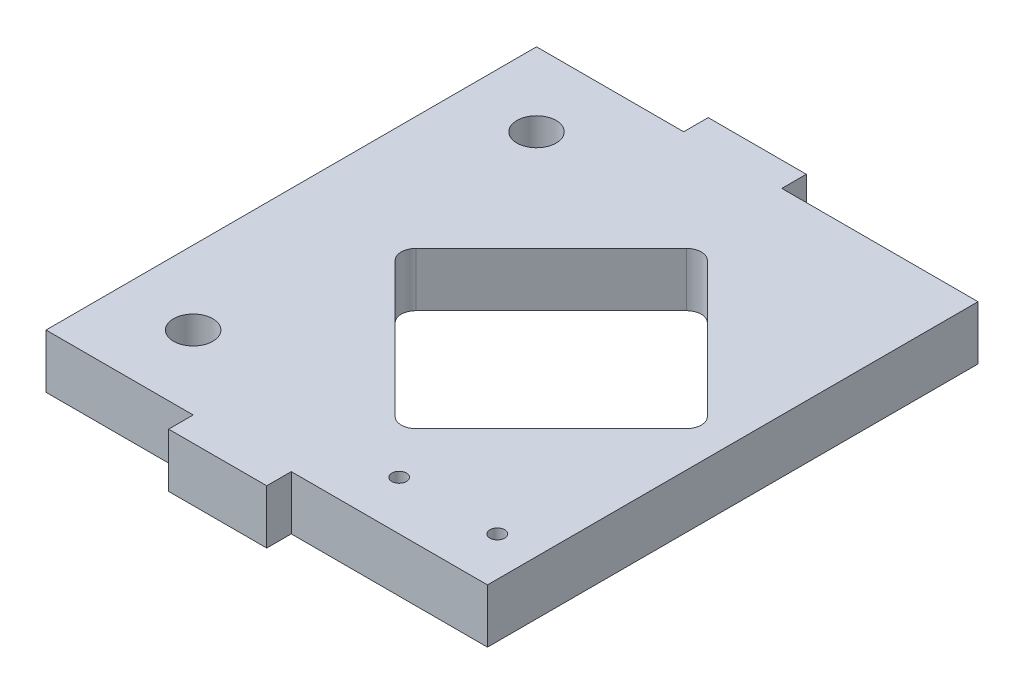
ISO-10303-21;
HEADER;
FILE_DESCRIPTION(('STEP AP214'),'2;1');
FILE_NAME('part.step','',(''),(''),'','','');
FILE_SCHEMA(('AUTOMOTIVE_DESIGN { 1 0 10303 214 1 1 1 1 }'));
ENDSEC;
DATA;
#1=APPLICATION_CONTEXT('core data for automotive mechanical design processes');
#2=APPLICATION_PROTOCOL_DEFINITION('international standard','automotive_design',2000,#1);
#3=PRODUCT_CONTEXT('',#1,'mechanical');
#4=PRODUCT('Part','Part','',(#3));
#5=PRODUCT_RELATED_PRODUCT_CATEGORY('part','',(#4));
#6=PRODUCT_DEFINITION_FORMATION('','',#4);
#7=PRODUCT_DEFINITION_CONTEXT('part definition',#1,'design');
#8=PRODUCT_DEFINITION('design','',#6,#7);
#9=PRODUCT_DEFINITION_SHAPE('','',#8);
#10=(LENGTH_UNIT() NAMED_UNIT(*) SI_UNIT(.MILLI.,.METRE.));
#11=(NAMED_UNIT(*) PLANE_ANGLE_UNIT() SI_UNIT($,.RADIAN.));
#12=(NAMED_UNIT(*) SI_UNIT($,.STERADIAN.) SOLID_ANGLE_UNIT());
#13=UNCERTAINTY_MEASURE_WITH_UNIT(LENGTH_MEASURE(1.E-05),#10,'distance_accuracy_value','');
#14=(GEOMETRIC_REPRESENTATION_CONTEXT(3) GLOBAL_UNCERTAINTY_ASSIGNED_CONTEXT((#13)) GLOBAL_UNIT_ASSIGNED_CONTEXT((#10,
#11,#12)) REPRESENTATION_CONTEXT('',''));
#15=CARTESIAN_POINT('',(0.,0.,0.));
#16=DIRECTION('',(0.,0.,1.));
#17=DIRECTION('',(1.,0.,0.));
#18=AXIS2_PLACEMENT_3D('',#15,#16,#17);
#19=CARTESIAN_POINT('',(0.,11.,0.));
#20=DIRECTION('',(0.,-1.,0.));
#21=DIRECTION('',(0.,0.,-1.));
#22=AXIS2_PLACEMENT_3D('',#19,#20,#21);
#23=PLANE('',#22);
#24=DIRECTION('',(0.707106781186547,0.,0.707106781186547));
#25=VECTOR('',#24,1.);
#26=CARTESIAN_POINT('',(-28.8198051533947,11.,0.));
#27=LINE('',#26,#25);
#28=CARTESIAN_POINT('',(-26.698484809835,11.,2.12132034355965));
#29=VERTEX_POINT('',#28);
#30=CARTESIAN_POINT('',(0.878679656440333,11.,29.698484809835));
#31=VERTEX_POINT('',#30);
#32=EDGE_CURVE('E246',#29,#31,#27,.T.);
#33=ORIENTED_EDGE('',*,*,#32,.F.);
#34=CARTESIAN_POINT('',(-24.5771644662754,11.,0.));
#35=DIRECTION('',(0.,-1.,0.));
#36=DIRECTION('',(0.,0.,-1.));
#37=AXIS2_PLACEMENT_3D('',#34,#35,#36);
#38=CIRCLE('',#37,3.);
#39=CARTESIAN_POINT('',(-26.698484809835,11.,-2.12132034355965));
#40=VERTEX_POINT('',#39);
#41=EDGE_CURVE('E228',#29,#40,#38,.T.);
#42=ORIENTED_EDGE('',*,*,#41,.T.);
#43=DIRECTION('',(-0.707106781186547,0.,0.707106781186547));
#44=VECTOR('',#43,1.);
#45=CARTESIAN_POINT('',(2.99999999999998,11.,-31.8198051533946));
#46=LINE('',#45,#44);
#47=CARTESIAN_POINT('',(0.878679656440333,11.,-29.698484809835));
#48=VERTEX_POINT('',#47);
#49=EDGE_CURVE('E268',#48,#40,#46,.T.);
#50=ORIENTED_EDGE('',*,*,#49,.F.);
#51=CARTESIAN_POINT('',(2.99999999999998,11.,-27.5771644662753));
#52=DIRECTION('',(0.,-1.,0.));
#53=DIRECTION('',(0.,0.,-1.));
#54=AXIS2_PLACEMENT_3D('',#51,#52,#53);
#55=CIRCLE('',#54,3.);
#56=CARTESIAN_POINT('',(5.12132034355962,11.,-29.698484809835));
#57=VERTEX_POINT('',#56);
#58=EDGE_CURVE('E224',#48,#57,#55,.T.);
#59=ORIENTED_EDGE('',*,*,#58,.T.);
#60=DIRECTION('',(-0.707106781186547,0.,-0.707106781186547));
#61=VECTOR('',#60,1.);
#62=CARTESIAN_POINT('',(34.8198051533946,11.,0.));
#63=LINE('',#62,#61);
#64=CARTESIAN_POINT('',(32.698484809835,11.,-2.12132034355964));
#65=VERTEX_POINT('',#64);
#66=EDGE_CURVE('E241',#65,#57,#63,.T.);
#67=ORIENTED_EDGE('',*,*,#66,.F.);
#68=CARTESIAN_POINT('',(30.5771644662753,11.,0.));
#69=DIRECTION('',(0.,-1.,0.));
#70=DIRECTION('',(0.,0.,-1.));
#71=AXIS2_PLACEMENT_3D('',#68,#69,#70);
#72=CIRCLE('',#71,3.);
#73=CARTESIAN_POINT('',(32.698484809835,11.,2.12132034355965));
#74=VERTEX_POINT('',#73);
#75=EDGE_CURVE('E45',#65,#74,#72,.T.);
#76=ORIENTED_EDGE('',*,*,#75,.T.);
#77=DIRECTION('',(0.707106781186547,0.,-0.707106781186548));
#78=VECTOR('',#77,1.);
#79=CARTESIAN_POINT('',(2.99999999999998,11.,31.8198051533946));
#80=LINE('',#79,#78);
#81=CARTESIAN_POINT('',(5.12132034355962,11.,29.698484809835));
#82=VERTEX_POINT('',#81);
#83=EDGE_CURVE('E239',#82,#74,#80,.T.);
#84=ORIENTED_EDGE('',*,*,#83,.F.);
#85=CARTESIAN_POINT('',(2.99999999999997,11.,27.5771644662754));
#86=DIRECTION('',(0.,-1.,0.));
#87=DIRECTION('',(0.,0.,-1.));
#88=AXIS2_PLACEMENT_3D('',#85,#86,#87);
#89=CIRCLE('',#88,3.);
#90=EDGE_CURVE('E232',#82,#31,#89,.T.);
#91=ORIENTED_EDGE('',*,*,#90,.T.);
#92=EDGE_LOOP('',(#33,#42,#50,#59,#67,#76,#84,#91));
#93=FACE_BOUND('',#92,.T.);
#94=CARTESIAN_POINT('',(32.,11.,40.));
#95=DIRECTION('',(0.,1.,0.));
#96=DIRECTION('',(0.,0.,1.));
#97=AXIS2_PLACEMENT_3D('',#94,#95,#96);
#98=CIRCLE('',#97,1.5);
#99=CARTESIAN_POINT('',(32.,11.,41.5));
#100=VERTEX_POINT('',#99);
#101=EDGE_CURVE('E279',#100,#100,#98,.T.);
#102=ORIENTED_EDGE('',*,*,#101,.F.);
#103=EDGE_LOOP('',(#102));
#104=FACE_BOUND('',#103,.T.);
#105=CARTESIAN_POINT('',(12.,11.,40.));
#106=DIRECTION('',(0.,1.,0.));
#107=DIRECTION('',(0.,0.,-1.));
#108=AXIS2_PLACEMENT_3D('',#105,#106,#107);
#109=CIRCLE('',#108,1.5);
#110=CARTESIAN_POINT('',(12.,11.,38.5));
#111=VERTEX_POINT('',#110);
#112=EDGE_CURVE('E259',#111,#111,#109,.T.);
#113=ORIENTED_EDGE('',*,*,#112,.F.);
#114=EDGE_LOOP('',(#113));
#115=FACE_BOUND('',#114,.T.);
#116=DIRECTION('',(1.,0.,0.));
#117=VECTOR('',#116,1.);
#118=CARTESIAN_POINT('',(0.,11.,50.));
#119=LINE('',#118,#117);
#120=CARTESIAN_POINT('',(0.,11.,50.));
#121=VERTEX_POINT('',#120);
#122=CARTESIAN_POINT('',(40.,11.,50.));
#123=VERTEX_POINT('',#122);
#124=EDGE_CURVE('E186',#121,#123,#119,.T.);
#125=ORIENTED_EDGE('',*,*,#124,.T.);
#126=DIRECTION('',(0.,0.,-1.));
#127=VECTOR('',#126,1.);
#128=CARTESIAN_POINT('',(40.,11.,-50.));
#129=LINE('',#128,#127);
#130=CARTESIAN_POINT('',(40.,11.,-50.));
#131=VERTEX_POINT('',#130);
#132=EDGE_CURVE('E175',#123,#131,#129,.T.);
#133=ORIENTED_EDGE('',*,*,#132,.T.);
#134=DIRECTION('',(-1.,0.,0.));
#135=VECTOR('',#134,1.);
#136=CARTESIAN_POINT('',(0.,11.,-50.));
#137=LINE('',#136,#135);
#138=CARTESIAN_POINT('',(0.,11.,-50.));
#139=VERTEX_POINT('',#138);
#140=EDGE_CURVE('E185',#131,#139,#137,.T.);
#141=ORIENTED_EDGE('',*,*,#140,.T.);
#142=DIRECTION('',(0.,0.,-1.));
#143=VECTOR('',#142,1.);
#144=CARTESIAN_POINT('',(0.,11.,-50.));
#145=LINE('',#144,#143);
#146=CARTESIAN_POINT('',(0.,11.,-55.));
#147=VERTEX_POINT('',#146);
#148=EDGE_CURVE('E296',#139,#147,#145,.T.);
#149=ORIENTED_EDGE('',*,*,#148,.T.);
#150=DIRECTION('',(-1.,0.,0.));
#151=VECTOR('',#150,1.);
#152=CARTESIAN_POINT('',(0.,11.,-55.));
#153=LINE('',#152,#151);
#154=CARTESIAN_POINT('',(-20.,11.,-55.));
#155=VERTEX_POINT('',#154);
#156=EDGE_CURVE('E298',#147,#155,#153,.T.);
#157=ORIENTED_EDGE('',*,*,#156,.T.);
#158=DIRECTION('',(0.,0.,1.));
#159=VECTOR('',#158,1.);
#160=CARTESIAN_POINT('',(-20.,11.,-50.));
#161=LINE('',#160,#159);
#162=CARTESIAN_POINT('',(-20.,11.,-50.));
#163=VERTEX_POINT('',#162);
#164=EDGE_CURVE('E300',#155,#163,#161,.T.);
#165=ORIENTED_EDGE('',*,*,#164,.T.);
#166=DIRECTION('',(-1.,0.,0.));
#167=VECTOR('',#166,1.);
#168=CARTESIAN_POINT('',(-40.,11.,-50.));
#169=LINE('',#168,#167);
#170=CARTESIAN_POINT('',(-50.,11.,-50.));
#171=VERTEX_POINT('',#170);
#172=EDGE_CURVE('E302',#163,#171,#169,.T.);
#173=ORIENTED_EDGE('',*,*,#172,.T.);
#174=DIRECTION('',(0.,0.,1.));
#175=VECTOR('',#174,1.);
#176=CARTESIAN_POINT('',(-50.,11.,-50.));
#177=LINE('',#176,#175);
#178=CARTESIAN_POINT('',(-50.,11.,50.));
#179=VERTEX_POINT('',#178);
#180=EDGE_CURVE('E304',#171,#179,#177,.T.);
#181=ORIENTED_EDGE('',*,*,#180,.T.);
#182=DIRECTION('',(1.,0.,0.));
#183=VECTOR('',#182,1.);
#184=CARTESIAN_POINT('',(-50.,11.,50.));
#185=LINE('',#184,#183);
#186=CARTESIAN_POINT('',(-20.,11.,50.));
#187=VERTEX_POINT('',#186);
#188=EDGE_CURVE('E306',#179,#187,#185,.T.);
#189=ORIENTED_EDGE('',*,*,#188,.T.);
#190=DIRECTION('',(0.,0.,1.));
#191=VECTOR('',#190,1.);
#192=CARTESIAN_POINT('',(-20.,11.,50.));
#193=LINE('',#192,#191);
#194=CARTESIAN_POINT('',(-20.,11.,55.));
#195=VERTEX_POINT('',#194);
#196=EDGE_CURVE('E308',#187,#195,#193,.T.);
#197=ORIENTED_EDGE('',*,*,#196,.T.);
#198=DIRECTION('',(1.,0.,0.));
#199=VECTOR('',#198,1.);
#200=CARTESIAN_POINT('',(0.,11.,55.));
#201=LINE('',#200,#199);
#202=CARTESIAN_POINT('',(0.,11.,55.));
#203=VERTEX_POINT('',#202);
#204=EDGE_CURVE('E310',#195,#203,#201,.T.);
#205=ORIENTED_EDGE('',*,*,#204,.T.);
#206=DIRECTION('',(0.,0.,-1.));
#207=VECTOR('',#206,1.);
#208=CARTESIAN_POINT('',(0.,11.,50.));
#209=LINE('',#208,#207);
#210=EDGE_CURVE('E191',#203,#121,#209,.T.);
#211=ORIENTED_EDGE('',*,*,#210,.T.);
#212=EDGE_LOOP('',(#125,#133,#141,#149,#157,#165,#173,#181,#189,#197,#205,#211));
#213=FACE_BOUND('',#212,.T.);
#214=CARTESIAN_POINT('',(-35.,11.,-35.));
#215=DIRECTION('',(0.,1.,0.));
#216=DIRECTION('',(0.,0.,1.));
#217=AXIS2_PLACEMENT_3D('',#214,#215,#216);
#218=CIRCLE('',#217,4.00000000000001);
#219=CARTESIAN_POINT('',(-35.,11.,-31.));
#220=VERTEX_POINT('',#219);
#221=EDGE_CURVE('E290',#220,#220,#218,.T.);
#222=ORIENTED_EDGE('',*,*,#221,.F.);
#223=EDGE_LOOP('',(#222));
#224=FACE_BOUND('',#223,.T.);
#225=CARTESIAN_POINT('',(-35.,11.,35.));
#226=DIRECTION('',(0.,1.,0.));
#227=DIRECTION('',(0.,0.,-1.));
#228=AXIS2_PLACEMENT_3D('',#225,#226,#227);
#229=CIRCLE('',#228,4.00000000000001);
#230=CARTESIAN_POINT('',(-35.,11.,31.));
#231=VERTEX_POINT('',#230);
#232=EDGE_CURVE('E284',#231,#231,#229,.T.);
#233=ORIENTED_EDGE('',*,*,#232,.F.);
#234=EDGE_LOOP('',(#233));
#235=FACE_BOUND('',#234,.T.);
#236=ADVANCED_FACE('F37',(#93,#104,#115,#213,#224,#235),#23,.F.);
#237=CARTESIAN_POINT('',(0.,0.,0.));
#238=DIRECTION('',(0.,-1.,0.));
#239=DIRECTION('',(0.,0.,-1.));
#240=AXIS2_PLACEMENT_3D('',#237,#238,#239);
#241=PLANE('',#240);
#242=DIRECTION('',(-0.707106781186547,0.,-0.707106781186547));
#243=VECTOR('',#242,1.);
#244=CARTESIAN_POINT('',(34.8198051533946,0.,0.));
#245=LINE('',#244,#243);
#246=CARTESIAN_POINT('',(32.698484809835,0.,-2.12132034355964));
#247=VERTEX_POINT('',#246);
#248=CARTESIAN_POINT('',(5.12132034355962,0.,-29.698484809835));
#249=VERTEX_POINT('',#248);
#250=EDGE_CURVE('E253',#247,#249,#245,.T.);
#251=ORIENTED_EDGE('',*,*,#250,.T.);
#252=CARTESIAN_POINT('',(2.99999999999998,0.,-27.5771644662753));
#253=DIRECTION('',(0.,-1.,0.));
#254=DIRECTION('',(0.,0.,-1.));
#255=AXIS2_PLACEMENT_3D('',#252,#253,#254);
#256=CIRCLE('',#255,3.);
#257=CARTESIAN_POINT('',(0.878679656440333,0.,-29.698484809835));
#258=VERTEX_POINT('',#257);
#259=EDGE_CURVE('E226',#249,#258,#256,.F.);
#260=ORIENTED_EDGE('',*,*,#259,.T.);
#261=DIRECTION('',(-0.707106781186547,0.,0.707106781186547));
#262=VECTOR('',#261,1.);
#263=CARTESIAN_POINT('',(2.99999999999998,0.,-31.8198051533946));
#264=LINE('',#263,#262);
#265=CARTESIAN_POINT('',(-26.698484809835,0.,-2.12132034355965));
#266=VERTEX_POINT('',#265);
#267=EDGE_CURVE('E274',#258,#266,#264,.T.);
#268=ORIENTED_EDGE('',*,*,#267,.T.);
#269=CARTESIAN_POINT('',(-24.5771644662754,0.,0.));
#270=DIRECTION('',(0.,-1.,0.));
#271=DIRECTION('',(0.,0.,-1.));
#272=AXIS2_PLACEMENT_3D('',#269,#270,#271);
#273=CIRCLE('',#272,3.);
#274=CARTESIAN_POINT('',(-26.698484809835,0.,2.12132034355965));
#275=VERTEX_POINT('',#274);
#276=EDGE_CURVE('E230',#266,#275,#273,.F.);
#277=ORIENTED_EDGE('',*,*,#276,.T.);
#278=DIRECTION('',(0.707106781186547,0.,0.707106781186547));
#279=VECTOR('',#278,1.);
#280=CARTESIAN_POINT('',(-28.8198051533947,0.,0.));
#281=LINE('',#280,#279);
#282=CARTESIAN_POINT('',(0.878679656440333,0.,29.698484809835));
#283=VERTEX_POINT('',#282);
#284=EDGE_CURVE('E264',#275,#283,#281,.T.);
#285=ORIENTED_EDGE('',*,*,#284,.T.);
#286=CARTESIAN_POINT('',(2.99999999999997,0.,27.5771644662754));
#287=DIRECTION('',(0.,-1.,0.));
#288=DIRECTION('',(0.,0.,-1.));
#289=AXIS2_PLACEMENT_3D('',#286,#287,#288);
#290=CIRCLE('',#289,3.);
#291=CARTESIAN_POINT('',(5.12132034355962,0.,29.698484809835));
#292=VERTEX_POINT('',#291);
#293=EDGE_CURVE('E59',#283,#292,#290,.F.);
#294=ORIENTED_EDGE('',*,*,#293,.T.);
#295=DIRECTION('',(0.707106781186547,0.,-0.707106781186548));
#296=VECTOR('',#295,1.);
#297=CARTESIAN_POINT('',(2.99999999999998,0.,31.8198051533946));
#298=LINE('',#297,#296);
#299=CARTESIAN_POINT('',(32.698484809835,0.,2.12132034355965));
#300=VERTEX_POINT('',#299);
#301=EDGE_CURVE('E255',#292,#300,#298,.T.);
#302=ORIENTED_EDGE('',*,*,#301,.T.);
#303=CARTESIAN_POINT('',(30.5771644662753,0.,0.));
#304=DIRECTION('',(0.,-1.,0.));
#305=DIRECTION('',(0.,0.,-1.));
#306=AXIS2_PLACEMENT_3D('',#303,#304,#305);
#307=CIRCLE('',#306,3.);
#308=EDGE_CURVE('E11',#300,#247,#307,.F.);
#309=ORIENTED_EDGE('',*,*,#308,.T.);
#310=EDGE_LOOP('',(#251,#260,#268,#277,#285,#294,#302,#309));
#311=FACE_BOUND('',#310,.T.);
#312=CARTESIAN_POINT('',(-35.,0.,-35.));
#313=DIRECTION('',(0.,1.,0.));
#314=DIRECTION('',(0.,0.,1.));
#315=AXIS2_PLACEMENT_3D('',#312,#313,#314);
#316=CIRCLE('',#315,4.00000000000001);
#317=CARTESIAN_POINT('',(-35.,0.,-31.));
#318=VERTEX_POINT('',#317);
#319=EDGE_CURVE('E287',#318,#318,#316,.T.);
#320=ORIENTED_EDGE('',*,*,#319,.T.);
#321=EDGE_LOOP('',(#320));
#322=FACE_BOUND('',#321,.T.);
#323=DIRECTION('',(1.,0.,0.));
#324=VECTOR('',#323,1.);
#325=CARTESIAN_POINT('',(0.,0.,50.));
#326=LINE('',#325,#324);
#327=CARTESIAN_POINT('',(0.,0.,50.));
#328=VERTEX_POINT('',#327);
#329=CARTESIAN_POINT('',(40.,0.,50.));
#330=VERTEX_POINT('',#329);
#331=EDGE_CURVE('E199',#328,#330,#326,.T.);
#332=ORIENTED_EDGE('',*,*,#331,.F.);
#333=DIRECTION('',(0.,0.,-1.));
#334=VECTOR('',#333,1.);
#335=CARTESIAN_POINT('',(0.,0.,50.));
#336=LINE('',#335,#334);
#337=CARTESIAN_POINT('',(0.,0.,55.));
#338=VERTEX_POINT('',#337);
#339=EDGE_CURVE('E195',#338,#328,#336,.T.);
#340=ORIENTED_EDGE('',*,*,#339,.F.);
#341=DIRECTION('',(1.,0.,0.));
#342=VECTOR('',#341,1.);
#343=CARTESIAN_POINT('',(0.,0.,55.));
#344=LINE('',#343,#342);
#345=CARTESIAN_POINT('',(-20.,0.,55.));
#346=VERTEX_POINT('',#345);
#347=EDGE_CURVE('E335',#346,#338,#344,.T.);
#348=ORIENTED_EDGE('',*,*,#347,.F.);
#349=DIRECTION('',(0.,0.,1.));
#350=VECTOR('',#349,1.);
#351=CARTESIAN_POINT('',(-20.,0.,50.));
#352=LINE('',#351,#350);
#353=CARTESIAN_POINT('',(-20.,0.,50.));
#354=VERTEX_POINT('',#353);
#355=EDGE_CURVE('E333',#354,#346,#352,.T.);
#356=ORIENTED_EDGE('',*,*,#355,.F.);
#357=DIRECTION('',(1.,0.,0.));
#358=VECTOR('',#357,1.);
#359=CARTESIAN_POINT('',(-40.,0.,50.));
#360=LINE('',#359,#358);
#361=CARTESIAN_POINT('',(-50.,0.,50.));
#362=VERTEX_POINT('',#361);
#363=EDGE_CURVE('E331',#362,#354,#360,.T.);
#364=ORIENTED_EDGE('',*,*,#363,.F.);
#365=DIRECTION('',(0.,0.,1.));
#366=VECTOR('',#365,1.);
#367=CARTESIAN_POINT('',(-50.,0.,-50.));
#368=LINE('',#367,#366);
#369=CARTESIAN_POINT('',(-50.,0.,-50.));
#370=VERTEX_POINT('',#369);
#371=EDGE_CURVE('E328',#370,#362,#368,.T.);
#372=ORIENTED_EDGE('',*,*,#371,.F.);
#373=DIRECTION('',(-1.,0.,0.));
#374=VECTOR('',#373,1.);
#375=CARTESIAN_POINT('',(-40.,0.,-50.));
#376=LINE('',#375,#374);
#377=CARTESIAN_POINT('',(-20.,0.,-50.));
#378=VERTEX_POINT('',#377);
#379=EDGE_CURVE('E326',#378,#370,#376,.T.);
#380=ORIENTED_EDGE('',*,*,#379,.F.);
#381=DIRECTION('',(0.,0.,1.));
#382=VECTOR('',#381,1.);
#383=CARTESIAN_POINT('',(-20.,0.,-50.));
#384=LINE('',#383,#382);
#385=CARTESIAN_POINT('',(-20.,0.,-55.));
#386=VERTEX_POINT('',#385);
#387=EDGE_CURVE('E323',#386,#378,#384,.T.);
#388=ORIENTED_EDGE('',*,*,#387,.F.);
#389=DIRECTION('',(-1.,0.,0.));
#390=VECTOR('',#389,1.);
#391=CARTESIAN_POINT('',(0.,0.,-55.));
#392=LINE('',#391,#390);
#393=CARTESIAN_POINT('',(0.,0.,-55.));
#394=VERTEX_POINT('',#393);
#395=EDGE_CURVE('E321',#394,#386,#392,.T.);
#396=ORIENTED_EDGE('',*,*,#395,.F.);
#397=DIRECTION('',(0.,0.,-1.));
#398=VECTOR('',#397,1.);
#399=CARTESIAN_POINT('',(0.,0.,-50.));
#400=LINE('',#399,#398);
#401=CARTESIAN_POINT('',(0.,0.,-50.));
#402=VERTEX_POINT('',#401);
#403=EDGE_CURVE('E319',#402,#394,#400,.T.);
#404=ORIENTED_EDGE('',*,*,#403,.F.);
#405=DIRECTION('',(-1.,0.,0.));
#406=VECTOR('',#405,1.);
#407=CARTESIAN_POINT('',(0.,0.,-50.));
#408=LINE('',#407,#406);
#409=CARTESIAN_POINT('',(40.,0.,-50.));
#410=VERTEX_POINT('',#409);
#411=EDGE_CURVE('E317',#410,#402,#408,.T.);
#412=ORIENTED_EDGE('',*,*,#411,.F.);
#413=DIRECTION('',(0.,0.,-1.));
#414=VECTOR('',#413,1.);
#415=CARTESIAN_POINT('',(40.,0.,-50.));
#416=LINE('',#415,#414);
#417=EDGE_CURVE('E315',#330,#410,#416,.T.);
#418=ORIENTED_EDGE('',*,*,#417,.F.);
#419=EDGE_LOOP('',(#332,#340,#348,#356,#364,#372,#380,#388,#396,#404,#412,#418));
#420=FACE_BOUND('',#419,.T.);
#421=CARTESIAN_POINT('',(-35.,0.,35.));
#422=DIRECTION('',(0.,1.,0.));
#423=DIRECTION('',(0.,0.,-1.));
#424=AXIS2_PLACEMENT_3D('',#421,#422,#423);
#425=CIRCLE('',#424,4.00000000000001);
#426=CARTESIAN_POINT('',(-35.,0.,31.));
#427=VERTEX_POINT('',#426);
#428=EDGE_CURVE('E278',#427,#427,#425,.T.);
#429=ORIENTED_EDGE('',*,*,#428,.T.);
#430=EDGE_LOOP('',(#429));
#431=FACE_BOUND('',#430,.T.);
#432=ADVANCED_FACE('F251',(#311,#322,#420,#431),#241,.T.);
#433=CARTESIAN_POINT('',(0.,11.,50.));
#434=DIRECTION('',(0.,0.,-1.));
#435=DIRECTION('',(-1.,0.,0.));
#436=AXIS2_PLACEMENT_3D('',#433,#434,#435);
#437=PLANE('',#436);
#438=ORIENTED_EDGE('',*,*,#331,.T.);
#439=DIRECTION('',(0.,-1.,0.));
#440=VECTOR('',#439,1.);
#441=CARTESIAN_POINT('',(40.,11.,50.));
#442=LINE('',#441,#440);
#443=EDGE_CURVE('E179',#123,#330,#442,.T.);
#444=ORIENTED_EDGE('',*,*,#443,.F.);
#445=ORIENTED_EDGE('',*,*,#124,.F.);
#446=DIRECTION('',(0.,-1.,0.));
#447=VECTOR('',#446,1.);
#448=CARTESIAN_POINT('',(0.,11.,50.));
#449=LINE('',#448,#447);
#450=EDGE_CURVE('E313',#121,#328,#449,.T.);
#451=ORIENTED_EDGE('',*,*,#450,.T.);
#452=EDGE_LOOP('',(#438,#444,#445,#451));
#453=FACE_BOUND('',#452,.T.);
#454=ADVANCED_FACE('F197',(#453),#437,.F.);
#455=CARTESIAN_POINT('',(40.,11.,-50.));
#456=DIRECTION('',(-1.,0.,0.));
#457=DIRECTION('',(0.,0.,1.));
#458=AXIS2_PLACEMENT_3D('',#455,#456,#457);
#459=PLANE('',#458);
#460=ORIENTED_EDGE('',*,*,#417,.T.);
#461=DIRECTION('',(0.,-1.,0.));
#462=VECTOR('',#461,1.);
#463=CARTESIAN_POINT('',(40.,11.,-50.));
#464=LINE('',#463,#462);
#465=EDGE_CURVE('E182',#131,#410,#464,.T.);
#466=ORIENTED_EDGE('',*,*,#465,.F.);
#467=ORIENTED_EDGE('',*,*,#132,.F.);
#468=ORIENTED_EDGE('',*,*,#443,.T.);
#469=EDGE_LOOP('',(#460,#466,#467,#468));
#470=FACE_BOUND('',#469,.T.);
#471=ADVANCED_FACE('F177',(#470),#459,.F.);
#472=CARTESIAN_POINT('',(0.,11.,-50.));
#473=DIRECTION('',(0.,0.,1.));
#474=DIRECTION('',(1.,0.,0.));
#475=AXIS2_PLACEMENT_3D('',#472,#473,#474);
#476=PLANE('',#475);
#477=ORIENTED_EDGE('',*,*,#411,.T.);
#478=DIRECTION('',(0.,-1.,0.));
#479=VECTOR('',#478,1.);
#480=CARTESIAN_POINT('',(0.,11.,-50.));
#481=LINE('',#480,#479);
#482=EDGE_CURVE('E204',#139,#402,#481,.T.);
#483=ORIENTED_EDGE('',*,*,#482,.F.);
#484=ORIENTED_EDGE('',*,*,#140,.F.);
#485=ORIENTED_EDGE('',*,*,#465,.T.);
#486=EDGE_LOOP('',(#477,#483,#484,#485));
#487=FACE_BOUND('',#486,.T.);
#488=ADVANCED_FACE('F385',(#487),#476,.F.);
#489=CARTESIAN_POINT('',(0.,11.,-50.));
#490=DIRECTION('',(-1.,0.,0.));
#491=DIRECTION('',(0.,0.,1.));
#492=AXIS2_PLACEMENT_3D('',#489,#490,#491);
#493=PLANE('',#492);
#494=ORIENTED_EDGE('',*,*,#403,.T.);
#495=DIRECTION('',(0.,-1.,0.));
#496=VECTOR('',#495,1.);
#497=CARTESIAN_POINT('',(0.,11.,-55.));
#498=LINE('',#497,#496);
#499=EDGE_CURVE('E360',#147,#394,#498,.T.);
#500=ORIENTED_EDGE('',*,*,#499,.F.);
#501=ORIENTED_EDGE('',*,*,#148,.F.);
#502=ORIENTED_EDGE('',*,*,#482,.T.);
#503=EDGE_LOOP('',(#494,#500,#501,#502));
#504=FACE_BOUND('',#503,.T.);
#505=ADVANCED_FACE('F367',(#504),#493,.F.);
#506=CARTESIAN_POINT('',(0.,11.,-55.));
#507=DIRECTION('',(0.,0.,1.));
#508=DIRECTION('',(1.,0.,0.));
#509=AXIS2_PLACEMENT_3D('',#506,#507,#508);
#510=PLANE('',#509);
#511=ORIENTED_EDGE('',*,*,#395,.T.);
#512=DIRECTION('',(0.,-1.,0.));
#513=VECTOR('',#512,1.);
#514=CARTESIAN_POINT('',(-20.,11.,-55.));
#515=LINE('',#514,#513);
#516=EDGE_CURVE('E357',#155,#386,#515,.T.);
#517=ORIENTED_EDGE('',*,*,#516,.F.);
#518=ORIENTED_EDGE('',*,*,#156,.F.);
#519=ORIENTED_EDGE('',*,*,#499,.T.);
#520=EDGE_LOOP('',(#511,#517,#518,#519));
#521=FACE_BOUND('',#520,.T.);
#522=ADVANCED_FACE('F377',(#521),#510,.F.);
#523=CARTESIAN_POINT('',(-20.,11.,-50.));
#524=DIRECTION('',(1.,0.,0.));
#525=DIRECTION('',(0.,0.,-1.));
#526=AXIS2_PLACEMENT_3D('',#523,#524,#525);
#527=PLANE('',#526);
#528=ORIENTED_EDGE('',*,*,#387,.T.);
#529=DIRECTION('',(0.,-1.,0.));
#530=VECTOR('',#529,1.);
#531=CARTESIAN_POINT('',(-20.,11.,-50.));
#532=LINE('',#531,#530);
#533=EDGE_CURVE('E354',#163,#378,#532,.T.);
#534=ORIENTED_EDGE('',*,*,#533,.F.);
#535=ORIENTED_EDGE('',*,*,#164,.F.);
#536=ORIENTED_EDGE('',*,*,#516,.T.);
#537=EDGE_LOOP('',(#528,#534,#535,#536));
#538=FACE_BOUND('',#537,.T.);
#539=ADVANCED_FACE('F381',(#538),#527,.F.);
#540=CARTESIAN_POINT('',(-40.,11.,-50.));
#541=DIRECTION('',(0.,0.,1.));
#542=DIRECTION('',(1.,0.,0.));
#543=AXIS2_PLACEMENT_3D('',#540,#541,#542);
#544=PLANE('',#543);
#545=ORIENTED_EDGE('',*,*,#379,.T.);
#546=DIRECTION('',(0.,-1.,0.));
#547=VECTOR('',#546,1.);
#548=CARTESIAN_POINT('',(-50.,11.,-50.));
#549=LINE('',#548,#547);
#550=EDGE_CURVE('E351',#171,#370,#549,.T.);
#551=ORIENTED_EDGE('',*,*,#550,.F.);
#552=ORIENTED_EDGE('',*,*,#172,.F.);
#553=ORIENTED_EDGE('',*,*,#533,.T.);
#554=EDGE_LOOP('',(#545,#551,#552,#553));
#555=FACE_BOUND('',#554,.T.);
#556=ADVANCED_FACE('F423',(#555),#544,.F.);
#557=CARTESIAN_POINT('',(-50.,11.,-50.));
#558=DIRECTION('',(1.,0.,0.));
#559=DIRECTION('',(0.,0.,-1.));
#560=AXIS2_PLACEMENT_3D('',#557,#558,#559);
#561=PLANE('',#560);
#562=ORIENTED_EDGE('',*,*,#371,.T.);
#563=DIRECTION('',(0.,-1.,0.));
#564=VECTOR('',#563,1.);
#565=CARTESIAN_POINT('',(-50.,11.,50.));
#566=LINE('',#565,#564);
#567=EDGE_CURVE('E348',#179,#362,#566,.T.);
#568=ORIENTED_EDGE('',*,*,#567,.F.);
#569=ORIENTED_EDGE('',*,*,#180,.F.);
#570=ORIENTED_EDGE('',*,*,#550,.T.);
#571=EDGE_LOOP('',(#562,#568,#569,#570));
#572=FACE_BOUND('',#571,.T.);
#573=ADVANCED_FACE('F419',(#572),#561,.F.);
#574=CARTESIAN_POINT('',(-40.,11.,50.));
#575=DIRECTION('',(0.,0.,-1.));
#576=DIRECTION('',(-1.,0.,0.));
#577=AXIS2_PLACEMENT_3D('',#574,#575,#576);
#578=PLANE('',#577);
#579=ORIENTED_EDGE('',*,*,#363,.T.);
#580=DIRECTION('',(0.,-1.,0.));
#581=VECTOR('',#580,1.);
#582=CARTESIAN_POINT('',(-20.,11.,50.));
#583=LINE('',#582,#581);
#584=EDGE_CURVE('E345',#187,#354,#583,.T.);
#585=ORIENTED_EDGE('',*,*,#584,.F.);
#586=ORIENTED_EDGE('',*,*,#188,.F.);
#587=ORIENTED_EDGE('',*,*,#567,.T.);
#588=EDGE_LOOP('',(#579,#585,#586,#587));
#589=FACE_BOUND('',#588,.T.);
#590=ADVANCED_FACE('F415',(#589),#578,.F.);
#591=CARTESIAN_POINT('',(-20.,11.,50.));
#592=DIRECTION('',(1.,0.,0.));
#593=DIRECTION('',(0.,0.,-1.));
#594=AXIS2_PLACEMENT_3D('',#591,#592,#593);
#595=PLANE('',#594);
#596=ORIENTED_EDGE('',*,*,#355,.T.);
#597=DIRECTION('',(0.,-1.,0.));
#598=VECTOR('',#597,1.);
#599=CARTESIAN_POINT('',(-20.,11.,55.));
#600=LINE('',#599,#598);
#601=EDGE_CURVE('E342',#195,#346,#600,.T.);
#602=ORIENTED_EDGE('',*,*,#601,.F.);
#603=ORIENTED_EDGE('',*,*,#196,.F.);
#604=ORIENTED_EDGE('',*,*,#584,.T.);
#605=EDGE_LOOP('',(#596,#602,#603,#604));
#606=FACE_BOUND('',#605,.T.);
#607=ADVANCED_FACE('F411',(#606),#595,.F.);
#608=CARTESIAN_POINT('',(0.,11.,55.));
#609=DIRECTION('',(0.,0.,-1.));
#610=DIRECTION('',(-1.,0.,0.));
#611=AXIS2_PLACEMENT_3D('',#608,#609,#610);
#612=PLANE('',#611);
#613=ORIENTED_EDGE('',*,*,#347,.T.);
#614=DIRECTION('',(0.,-1.,0.));
#615=VECTOR('',#614,1.);
#616=CARTESIAN_POINT('',(0.,11.,55.));
#617=LINE('',#616,#615);
#618=EDGE_CURVE('E339',#203,#338,#617,.T.);
#619=ORIENTED_EDGE('',*,*,#618,.F.);
#620=ORIENTED_EDGE('',*,*,#204,.F.);
#621=ORIENTED_EDGE('',*,*,#601,.T.);
#622=EDGE_LOOP('',(#613,#619,#620,#621));
#623=FACE_BOUND('',#622,.T.);
#624=ADVANCED_FACE('F407',(#623),#612,.F.);
#625=CARTESIAN_POINT('',(0.,11.,50.));
#626=DIRECTION('',(-1.,0.,0.));
#627=DIRECTION('',(0.,0.,1.));
#628=AXIS2_PLACEMENT_3D('',#625,#626,#627);
#629=PLANE('',#628);
#630=ORIENTED_EDGE('',*,*,#339,.T.);
#631=ORIENTED_EDGE('',*,*,#450,.F.);
#632=ORIENTED_EDGE('',*,*,#210,.F.);
#633=ORIENTED_EDGE('',*,*,#618,.T.);
#634=EDGE_LOOP('',(#630,#631,#632,#633));
#635=FACE_BOUND('',#634,.T.);
#636=ADVANCED_FACE('F404',(#635),#629,.F.);
#637=CARTESIAN_POINT('',(-35.,11.,-35.));
#638=DIRECTION('',(0.,-1.,0.));
#639=DIRECTION('',(0.,0.,-1.));
#640=AXIS2_PLACEMENT_3D('',#637,#638,#639);
#641=CYLINDRICAL_SURFACE('',#640,4.00000000000001);
#642=ORIENTED_EDGE('',*,*,#221,.T.);
#643=EDGE_LOOP('',(#642));
#644=FACE_BOUND('',#643,.T.);
#645=ORIENTED_EDGE('',*,*,#319,.F.);
#646=EDGE_LOOP('',(#645));
#647=FACE_BOUND('',#646,.T.);
#648=ADVANCED_FACE('F401',(#644,#647),#641,.F.);
#649=CARTESIAN_POINT('',(-35.,11.,35.));
#650=DIRECTION('',(0.,-1.,0.));
#651=DIRECTION('',(0.,0.,-1.));
#652=AXIS2_PLACEMENT_3D('',#649,#650,#651);
#653=CYLINDRICAL_SURFACE('',#652,4.00000000000001);
#654=ORIENTED_EDGE('',*,*,#232,.T.);
#655=EDGE_LOOP('',(#654));
#656=FACE_BOUND('',#655,.T.);
#657=ORIENTED_EDGE('',*,*,#428,.F.);
#658=EDGE_LOOP('',(#657));
#659=FACE_BOUND('',#658,.T.);
#660=ADVANCED_FACE('F469',(#656,#659),#653,.F.);
#661=CARTESIAN_POINT('',(12.,0.999999999999999,40.));
#662=DIRECTION('',(0.,1.,0.));
#663=DIRECTION('',(0.,0.,1.));
#664=AXIS2_PLACEMENT_3D('',#661,#662,#663);
#665=CYLINDRICAL_SURFACE('',#664,1.5);
#666=CARTESIAN_POINT('',(12.,0.999999999999999,40.));
#667=DIRECTION('',(0.,1.,0.));
#668=DIRECTION('',(0.,0.,-1.));
#669=AXIS2_PLACEMENT_3D('',#666,#667,#668);
#670=CIRCLE('',#669,1.5);
#671=CARTESIAN_POINT('',(12.,0.999999999999999,38.5));
#672=VERTEX_POINT('',#671);
#673=EDGE_CURVE('E262',#672,#672,#670,.T.);
#674=ORIENTED_EDGE('',*,*,#673,.F.);
#675=EDGE_LOOP('',(#674));
#676=FACE_BOUND('',#675,.T.);
#677=ORIENTED_EDGE('',*,*,#112,.T.);
#678=EDGE_LOOP('',(#677));
#679=FACE_BOUND('',#678,.T.);
#680=ADVANCED_FACE('F476',(#676,#679),#665,.F.);
#681=CARTESIAN_POINT('',(12.,0.999999999999999,40.));
#682=DIRECTION('',(0.,-1.,0.));
#683=DIRECTION('',(0.,0.,-1.));
#684=AXIS2_PLACEMENT_3D('',#681,#682,#683);
#685=PLANE('',#684);
#686=ORIENTED_EDGE('',*,*,#673,.T.);
#687=EDGE_LOOP('',(#686));
#688=FACE_BOUND('',#687,.T.);
#689=ADVANCED_FACE('F483',(#688),#685,.F.);
#690=CARTESIAN_POINT('',(32.,0.999999999999999,40.));
#691=DIRECTION('',(0.,1.,0.));
#692=DIRECTION('',(0.,0.,1.));
#693=AXIS2_PLACEMENT_3D('',#690,#691,#692);
#694=CYLINDRICAL_SURFACE('',#693,1.5);
#695=CARTESIAN_POINT('',(32.,0.999999999999999,40.));
#696=DIRECTION('',(0.,1.,0.));
#697=DIRECTION('',(0.,0.,1.));
#698=AXIS2_PLACEMENT_3D('',#695,#696,#697);
#699=CIRCLE('',#698,1.5);
#700=CARTESIAN_POINT('',(32.,0.999999999999999,41.5));
#701=VERTEX_POINT('',#700);
#702=EDGE_CURVE('E275',#701,#701,#699,.T.);
#703=ORIENTED_EDGE('',*,*,#702,.F.);
#704=EDGE_LOOP('',(#703));
#705=FACE_BOUND('',#704,.T.);
#706=ORIENTED_EDGE('',*,*,#101,.T.);
#707=EDGE_LOOP('',(#706));
#708=FACE_BOUND('',#707,.T.);
#709=ADVANCED_FACE('F491',(#705,#708),#694,.F.);
#710=CARTESIAN_POINT('',(32.,0.999999999999999,40.));
#711=DIRECTION('',(0.,1.,0.));
#712=DIRECTION('',(0.,0.,1.));
#713=AXIS2_PLACEMENT_3D('',#710,#711,#712);
#714=PLANE('',#713);
#715=ORIENTED_EDGE('',*,*,#702,.T.);
#716=EDGE_LOOP('',(#715));
#717=FACE_BOUND('',#716,.T.);
#718=ADVANCED_FACE('F499',(#717),#714,.T.);
#719=CARTESIAN_POINT('',(2.99999999999998,0.,-31.8198051533946));
#720=DIRECTION('',(-0.707106781186548,0.,-0.707106781186548));
#721=DIRECTION('',(-0.707106781186548,0.,0.707106781186548));
#722=AXIS2_PLACEMENT_3D('',#719,#720,#721);
#723=PLANE('',#722);
#724=ORIENTED_EDGE('',*,*,#267,.F.);
#725=DIRECTION('',(0.,1.,0.));
#726=VECTOR('',#725,1.);
#727=CARTESIAN_POINT('',(0.878679656440333,11.,-29.698484809835));
#728=LINE('',#727,#726);
#729=EDGE_CURVE('E202',#258,#48,#728,.T.);
#730=ORIENTED_EDGE('',*,*,#729,.T.);
#731=ORIENTED_EDGE('',*,*,#49,.T.);
#732=DIRECTION('',(0.,1.,0.));
#733=VECTOR('',#732,1.);
#734=CARTESIAN_POINT('',(-26.698484809835,0.,-2.12132034355964));
#735=LINE('',#734,#733);
#736=EDGE_CURVE('E200',#40,#266,#735,.F.);
#737=ORIENTED_EDGE('',*,*,#736,.T.);
#738=EDGE_LOOP('',(#724,#730,#731,#737));
#739=FACE_BOUND('',#738,.T.);
#740=ADVANCED_FACE('F507',(#739),#723,.F.);
#741=CARTESIAN_POINT('',(34.8198051533946,0.,0.));
#742=DIRECTION('',(0.707106781186548,0.,-0.707106781186548));
#743=DIRECTION('',(-0.707106781186548,0.,-0.707106781186548));
#744=AXIS2_PLACEMENT_3D('',#741,#742,#743);
#745=PLANE('',#744);
#746=ORIENTED_EDGE('',*,*,#66,.T.);
#747=DIRECTION('',(0.,1.,0.));
#748=VECTOR('',#747,1.);
#749=CARTESIAN_POINT('',(5.12132034355962,0.,-29.698484809835));
#750=LINE('',#749,#748);
#751=EDGE_CURVE('E213',#57,#249,#750,.F.);
#752=ORIENTED_EDGE('',*,*,#751,.T.);
#753=ORIENTED_EDGE('',*,*,#250,.F.);
#754=DIRECTION('',(0.,1.,0.));
#755=VECTOR('',#754,1.);
#756=CARTESIAN_POINT('',(32.698484809835,11.,-2.12132034355964));
#757=LINE('',#756,#755);
#758=EDGE_CURVE('E210',#247,#65,#757,.T.);
#759=ORIENTED_EDGE('',*,*,#758,.T.);
#760=EDGE_LOOP('',(#746,#752,#753,#759));
#761=FACE_BOUND('',#760,.T.);
#762=ADVANCED_FACE('F257',(#761),#745,.F.);
#763=CARTESIAN_POINT('',(2.99999999999998,0.,31.8198051533946));
#764=DIRECTION('',(0.707106781186548,0.,0.707106781186547));
#765=DIRECTION('',(0.707106781186547,0.,-0.707106781186548));
#766=AXIS2_PLACEMENT_3D('',#763,#764,#765);
#767=PLANE('',#766);
#768=ORIENTED_EDGE('',*,*,#301,.F.);
#769=DIRECTION('',(0.,1.,0.));
#770=VECTOR('',#769,1.);
#771=CARTESIAN_POINT('',(5.12132034355962,11.,29.698484809835));
#772=LINE('',#771,#770);
#773=EDGE_CURVE('E221',#292,#82,#772,.T.);
#774=ORIENTED_EDGE('',*,*,#773,.T.);
#775=ORIENTED_EDGE('',*,*,#83,.T.);
#776=DIRECTION('',(0.,1.,0.));
#777=VECTOR('',#776,1.);
#778=CARTESIAN_POINT('',(32.698484809835,0.,2.12132034355965));
#779=LINE('',#778,#777);
#780=EDGE_CURVE('E52',#74,#300,#779,.F.);
#781=ORIENTED_EDGE('',*,*,#780,.T.);
#782=EDGE_LOOP('',(#768,#774,#775,#781));
#783=FACE_BOUND('',#782,.T.);
#784=ADVANCED_FACE('F244',(#783),#767,.F.);
#785=CARTESIAN_POINT('',(-28.8198051533947,0.,0.));
#786=DIRECTION('',(-0.707106781186548,0.,0.707106781186548));
#787=DIRECTION('',(0.707106781186548,0.,0.707106781186548));
#788=AXIS2_PLACEMENT_3D('',#785,#786,#787);
#789=PLANE('',#788);
#790=ORIENTED_EDGE('',*,*,#284,.F.);
#791=DIRECTION('',(0.,1.,0.));
#792=VECTOR('',#791,1.);
#793=CARTESIAN_POINT('',(-26.698484809835,11.,2.12132034355965));
#794=LINE('',#793,#792);
#795=EDGE_CURVE('E217',#275,#29,#794,.T.);
#796=ORIENTED_EDGE('',*,*,#795,.T.);
#797=ORIENTED_EDGE('',*,*,#32,.T.);
#798=DIRECTION('',(0.,1.,0.));
#799=VECTOR('',#798,1.);
#800=CARTESIAN_POINT('',(0.878679656440336,0.,29.698484809835));
#801=LINE('',#800,#799);
#802=EDGE_CURVE('E215',#31,#283,#801,.F.);
#803=ORIENTED_EDGE('',*,*,#802,.T.);
#804=EDGE_LOOP('',(#790,#796,#797,#803));
#805=FACE_BOUND('',#804,.T.);
#806=ADVANCED_FACE('F529',(#805),#789,.F.);
#807=CARTESIAN_POINT('',(2.99999999999998,0.,-27.5771644662753));
#808=DIRECTION('',(0.,-1.,0.));
#809=DIRECTION('',(0.,0.,-1.));
#810=AXIS2_PLACEMENT_3D('',#807,#808,#809);
#811=CYLINDRICAL_SURFACE('',#810,3.);
#812=ORIENTED_EDGE('',*,*,#259,.F.);
#813=ORIENTED_EDGE('',*,*,#751,.F.);
#814=ORIENTED_EDGE('',*,*,#58,.F.);
#815=ORIENTED_EDGE('',*,*,#729,.F.);
#816=EDGE_LOOP('',(#812,#813,#814,#815));
#817=FACE_BOUND('',#816,.T.);
#818=ADVANCED_FACE('F536',(#817),#811,.F.);
#819=CARTESIAN_POINT('',(-24.5771644662754,0.,0.));
#820=DIRECTION('',(0.,-1.,0.));
#821=DIRECTION('',(0.,0.,-1.));
#822=AXIS2_PLACEMENT_3D('',#819,#820,#821);
#823=CYLINDRICAL_SURFACE('',#822,3.);
#824=ORIENTED_EDGE('',*,*,#276,.F.);
#825=ORIENTED_EDGE('',*,*,#736,.F.);
#826=ORIENTED_EDGE('',*,*,#41,.F.);
#827=ORIENTED_EDGE('',*,*,#795,.F.);
#828=EDGE_LOOP('',(#824,#825,#826,#827));
#829=FACE_BOUND('',#828,.T.);
#830=ADVANCED_FACE('F544',(#829),#823,.F.);
#831=CARTESIAN_POINT('',(2.99999999999997,0.,27.5771644662754));
#832=DIRECTION('',(0.,-1.,0.));
#833=DIRECTION('',(0.,0.,-1.));
#834=AXIS2_PLACEMENT_3D('',#831,#832,#833);
#835=CYLINDRICAL_SURFACE('',#834,3.);
#836=ORIENTED_EDGE('',*,*,#293,.F.);
#837=ORIENTED_EDGE('',*,*,#802,.F.);
#838=ORIENTED_EDGE('',*,*,#90,.F.);
#839=ORIENTED_EDGE('',*,*,#773,.F.);
#840=EDGE_LOOP('',(#836,#837,#838,#839));
#841=FACE_BOUND('',#840,.T.);
#842=ADVANCED_FACE('F552',(#841),#835,.F.);
#843=CARTESIAN_POINT('',(30.5771644662753,0.,0.));
#844=DIRECTION('',(0.,-1.,0.));
#845=DIRECTION('',(0.,0.,-1.));
#846=AXIS2_PLACEMENT_3D('',#843,#844,#845);
#847=CYLINDRICAL_SURFACE('',#846,3.);
#848=ORIENTED_EDGE('',*,*,#308,.F.);
#849=ORIENTED_EDGE('',*,*,#780,.F.);
#850=ORIENTED_EDGE('',*,*,#75,.F.);
#851=ORIENTED_EDGE('',*,*,#758,.F.);
#852=EDGE_LOOP('',(#848,#849,#850,#851));
#853=FACE_BOUND('',#852,.T.);
#854=ADVANCED_FACE('F39',(#853),#847,.F.);
#855=CLOSED_SHELL('',(#236,#432,#454,#471,#488,#505,#522,#539,#556,#573,#590,#607,#624,#636,
#648,#660,#680,#689,#709,#718,#740,#762,#784,#806,#818,#830,#842,#854));
#856=MANIFOLD_SOLID_BREP('B2',#855);
#857=ADVANCED_BREP_SHAPE_REPRESENTATION('',(#18,#856),#14);
#858=SHAPE_DEFINITION_REPRESENTATION(#9,#857);
ENDSEC;
END-ISO-10303-21;
